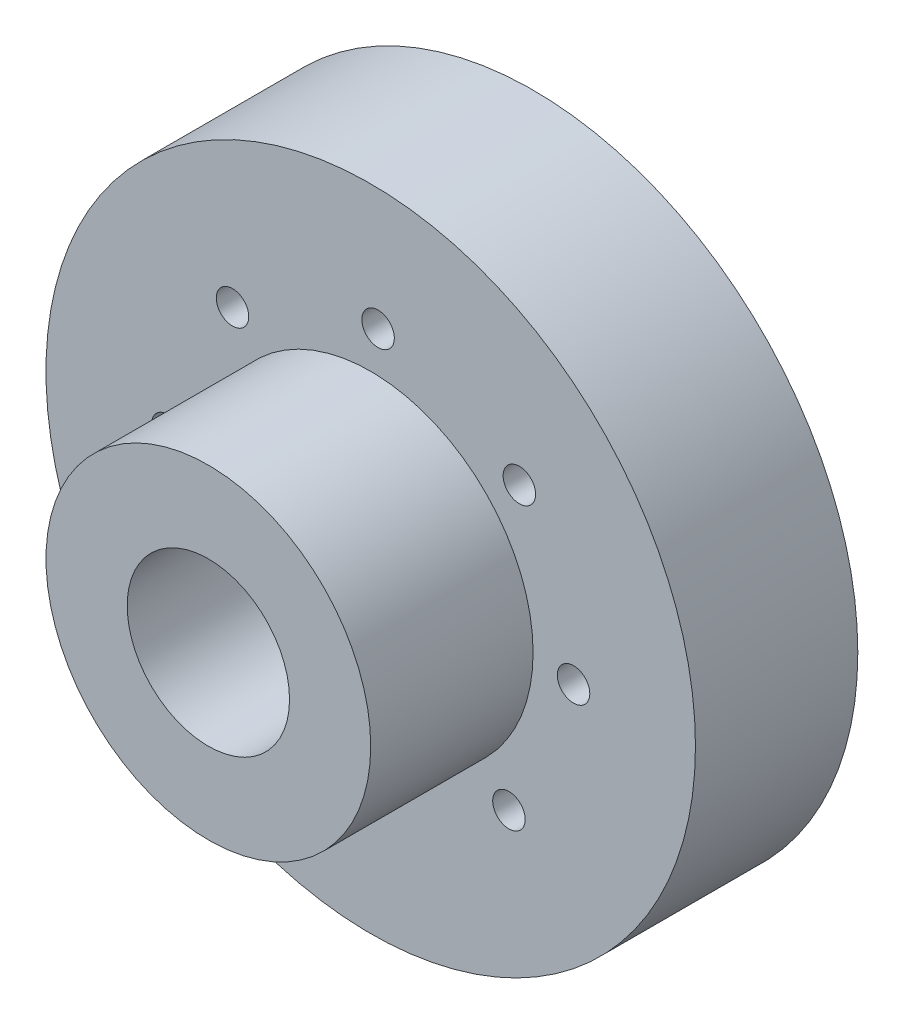
ISO-10303-21;
HEADER;
FILE_DESCRIPTION(('STEP AP214'),'2;1');
FILE_NAME('part.step','',(''),(''),'','','');
FILE_SCHEMA(('AUTOMOTIVE_DESIGN { 1 0 10303 214 1 1 1 1 }'));
ENDSEC;
DATA;
#1=APPLICATION_CONTEXT('core data for automotive mechanical design processes');
#2=APPLICATION_PROTOCOL_DEFINITION('international standard','automotive_design',2000,#1);
#3=PRODUCT_CONTEXT('',#1,'mechanical');
#4=PRODUCT('Part','Part','',(#3));
#5=PRODUCT_RELATED_PRODUCT_CATEGORY('part','',(#4));
#6=PRODUCT_DEFINITION_FORMATION('','',#4);
#7=PRODUCT_DEFINITION_CONTEXT('part definition',#1,'design');
#8=PRODUCT_DEFINITION('design','',#6,#7);
#9=PRODUCT_DEFINITION_SHAPE('','',#8);
#10=(LENGTH_UNIT() NAMED_UNIT(*) SI_UNIT(.MILLI.,.METRE.));
#11=(NAMED_UNIT(*) PLANE_ANGLE_UNIT() SI_UNIT($,.RADIAN.));
#12=(NAMED_UNIT(*) SI_UNIT($,.STERADIAN.) SOLID_ANGLE_UNIT());
#13=UNCERTAINTY_MEASURE_WITH_UNIT(LENGTH_MEASURE(1.E-05),#10,'distance_accuracy_value','');
#14=(GEOMETRIC_REPRESENTATION_CONTEXT(3) GLOBAL_UNCERTAINTY_ASSIGNED_CONTEXT((#13)) GLOBAL_UNIT_ASSIGNED_CONTEXT((#10,
#11,#12)) REPRESENTATION_CONTEXT('',''));
#15=CARTESIAN_POINT('',(0.,0.,0.));
#16=DIRECTION('',(0.,0.,1.));
#17=DIRECTION('',(1.,0.,0.));
#18=AXIS2_PLACEMENT_3D('',#15,#16,#17);
#19=CARTESIAN_POINT('',(0.,0.,12.7));
#20=DIRECTION('',(0.,0.,-1.));
#21=DIRECTION('',(-1.,0.,0.));
#22=AXIS2_PLACEMENT_3D('',#19,#20,#21);
#23=CYLINDRICAL_SURFACE('',#22,12.7);
#24=CARTESIAN_POINT('',(0.,0.,0.));
#25=DIRECTION('',(0.,0.,1.));
#26=DIRECTION('',(1.,0.,0.));
#27=AXIS2_PLACEMENT_3D('',#24,#25,#26);
#28=CIRCLE('',#27,12.7);
#29=CARTESIAN_POINT('',(12.7,0.,0.));
#30=VERTEX_POINT('',#29);
#31=EDGE_CURVE('E10',#30,#30,#28,.T.);
#32=ORIENTED_EDGE('',*,*,#31,.T.);
#33=EDGE_LOOP('',(#32));
#34=FACE_BOUND('',#33,.T.);
#35=CARTESIAN_POINT('',(0.,0.,6.35));
#36=DIRECTION('',(0.,0.,1.));
#37=DIRECTION('',(1.,0.,0.));
#38=AXIS2_PLACEMENT_3D('',#35,#36,#37);
#39=CIRCLE('',#38,12.7);
#40=CARTESIAN_POINT('',(12.7,0.,6.35));
#41=VERTEX_POINT('',#40);
#42=EDGE_CURVE('E32',#41,#41,#39,.T.);
#43=ORIENTED_EDGE('',*,*,#42,.F.);
#44=EDGE_LOOP('',(#43));
#45=FACE_BOUND('',#44,.T.);
#46=ADVANCED_FACE('F29',(#34,#45),#23,.T.);
#47=CARTESIAN_POINT('',(0.,0.,12.7));
#48=DIRECTION('',(0.,0.,1.));
#49=DIRECTION('',(1.,0.,0.));
#50=AXIS2_PLACEMENT_3D('',#47,#48,#49);
#51=PLANE('',#50);
#52=CARTESIAN_POINT('',(0.,0.,12.7));
#53=DIRECTION('',(0.,0.,1.));
#54=DIRECTION('',(1.,0.,0.));
#55=AXIS2_PLACEMENT_3D('',#52,#53,#54);
#56=CIRCLE('',#55,3.175);
#57=CARTESIAN_POINT('',(3.175,0.,12.7));
#58=VERTEX_POINT('',#57);
#59=EDGE_CURVE('E40',#58,#58,#56,.T.);
#60=ORIENTED_EDGE('',*,*,#59,.F.);
#61=EDGE_LOOP('',(#60));
#62=FACE_BOUND('',#61,.T.);
#63=CARTESIAN_POINT('',(0.,0.,12.7));
#64=DIRECTION('',(0.,0.,1.));
#65=DIRECTION('',(1.,0.,0.));
#66=AXIS2_PLACEMENT_3D('',#63,#64,#65);
#67=CIRCLE('',#66,6.35);
#68=CARTESIAN_POINT('',(6.35,0.,12.7));
#69=VERTEX_POINT('',#68);
#70=EDGE_CURVE('E45',#69,#69,#67,.T.);
#71=ORIENTED_EDGE('',*,*,#70,.T.);
#72=EDGE_LOOP('',(#71));
#73=FACE_BOUND('',#72,.T.);
#74=ADVANCED_FACE('F136',(#62,#73),#51,.T.);
#75=CARTESIAN_POINT('',(0.,0.,0.));
#76=DIRECTION('',(0.,0.,1.));
#77=DIRECTION('',(1.,0.,0.));
#78=AXIS2_PLACEMENT_3D('',#75,#76,#77);
#79=PLANE('',#78);
#80=CARTESIAN_POINT('',(-5.40521650843742,5.81270511439515,0.));
#81=DIRECTION('',(0.,0.,1.));
#82=DIRECTION('',(1.,0.,0.));
#83=AXIS2_PLACEMENT_3D('',#80,#81,#82);
#84=CIRCLE('',#83,0.635);
#85=CARTESIAN_POINT('',(-4.77021650843742,5.81270511439515,0.));
#86=VERTEX_POINT('',#85);
#87=EDGE_CURVE('E91',#86,#86,#84,.T.);
#88=ORIENTED_EDGE('',*,*,#87,.T.);
#89=EDGE_LOOP('',(#88));
#90=FACE_BOUND('',#89,.T.);
#91=CARTESIAN_POINT('',(-7.93226845032411,0.28813795652895,0.));
#92=DIRECTION('',(0.,0.,1.));
#93=DIRECTION('',(1.,0.,0.));
#94=AXIS2_PLACEMENT_3D('',#91,#92,#93);
#95=CIRCLE('',#94,0.635);
#96=CARTESIAN_POINT('',(-7.29726845032411,0.28813795652895,0.));
#97=VERTEX_POINT('',#96);
#98=EDGE_CURVE('E85',#97,#97,#95,.T.);
#99=ORIENTED_EDGE('',*,*,#98,.T.);
#100=EDGE_LOOP('',(#99));
#101=FACE_BOUND('',#100,.T.);
#102=CARTESIAN_POINT('',(-5.81270511439513,-5.40521650843744,0.));
#103=DIRECTION('',(0.,0.,1.));
#104=DIRECTION('',(1.,0.,0.));
#105=AXIS2_PLACEMENT_3D('',#102,#103,#104);
#106=CIRCLE('',#105,0.635000000000001);
#107=CARTESIAN_POINT('',(-5.17770511439513,-5.40521650843744,0.));
#108=VERTEX_POINT('',#107);
#109=EDGE_CURVE('E79',#108,#108,#106,.T.);
#110=ORIENTED_EDGE('',*,*,#109,.T.);
#111=EDGE_LOOP('',(#110));
#112=FACE_BOUND('',#111,.T.);
#113=CARTESIAN_POINT('',(-0.288137956528922,-7.93226845032411,0.));
#114=DIRECTION('',(0.,0.,1.));
#115=DIRECTION('',(1.,0.,0.));
#116=AXIS2_PLACEMENT_3D('',#113,#114,#115);
#117=CIRCLE('',#116,0.635);
#118=CARTESIAN_POINT('',(0.346862043471077,-7.93226845032411,0.));
#119=VERTEX_POINT('',#118);
#120=EDGE_CURVE('E73',#119,#119,#117,.T.);
#121=ORIENTED_EDGE('',*,*,#120,.T.);
#122=EDGE_LOOP('',(#121));
#123=FACE_BOUND('',#122,.T.);
#124=CARTESIAN_POINT('',(5.40521650843746,-5.81270511439511,0.));
#125=DIRECTION('',(0.,0.,1.));
#126=DIRECTION('',(1.,0.,0.));
#127=AXIS2_PLACEMENT_3D('',#124,#125,#126);
#128=CIRCLE('',#127,0.635);
#129=CARTESIAN_POINT('',(6.04021650843746,-5.81270511439511,0.));
#130=VERTEX_POINT('',#129);
#131=EDGE_CURVE('E67',#130,#130,#128,.T.);
#132=ORIENTED_EDGE('',*,*,#131,.T.);
#133=EDGE_LOOP('',(#132));
#134=FACE_BOUND('',#133,.T.);
#135=CARTESIAN_POINT('',(7.93226845032412,-0.288137956528896,0.));
#136=DIRECTION('',(0.,0.,1.));
#137=DIRECTION('',(1.,0.,0.));
#138=AXIS2_PLACEMENT_3D('',#135,#136,#137);
#139=CIRCLE('',#138,0.635);
#140=CARTESIAN_POINT('',(8.56726845032412,-0.288137956528896,0.));
#141=VERTEX_POINT('',#140);
#142=EDGE_CURVE('E61',#141,#141,#139,.T.);
#143=ORIENTED_EDGE('',*,*,#142,.T.);
#144=EDGE_LOOP('',(#143));
#145=FACE_BOUND('',#144,.T.);
#146=CARTESIAN_POINT('',(5.8127051143951,5.40521650843748,0.));
#147=DIRECTION('',(0.,0.,1.));
#148=DIRECTION('',(1.,0.,0.));
#149=AXIS2_PLACEMENT_3D('',#146,#147,#148);
#150=CIRCLE('',#149,0.635);
#151=CARTESIAN_POINT('',(6.4477051143951,5.40521650843748,0.));
#152=VERTEX_POINT('',#151);
#153=EDGE_CURVE('E55',#152,#152,#150,.T.);
#154=ORIENTED_EDGE('',*,*,#153,.T.);
#155=EDGE_LOOP('',(#154));
#156=FACE_BOUND('',#155,.T.);
#157=CARTESIAN_POINT('',(0.288137956528867,7.93226845032412,0.));
#158=DIRECTION('',(0.,0.,1.));
#159=DIRECTION('',(1.,0.,0.));
#160=AXIS2_PLACEMENT_3D('',#157,#158,#159);
#161=CIRCLE('',#160,0.635);
#162=CARTESIAN_POINT('',(0.923137956528867,7.93226845032412,0.));
#163=VERTEX_POINT('',#162);
#164=EDGE_CURVE('E49',#163,#163,#161,.T.);
#165=ORIENTED_EDGE('',*,*,#164,.T.);
#166=EDGE_LOOP('',(#165));
#167=FACE_BOUND('',#166,.T.);
#168=CARTESIAN_POINT('',(0.,0.,0.));
#169=DIRECTION('',(0.,0.,1.));
#170=DIRECTION('',(1.,0.,0.));
#171=AXIS2_PLACEMENT_3D('',#168,#169,#170);
#172=CIRCLE('',#171,3.175);
#173=CARTESIAN_POINT('',(3.175,0.,0.));
#174=VERTEX_POINT('',#173);
#175=EDGE_CURVE('E36',#174,#174,#172,.T.);
#176=ORIENTED_EDGE('',*,*,#175,.T.);
#177=EDGE_LOOP('',(#176));
#178=FACE_BOUND('',#177,.T.);
#179=ORIENTED_EDGE('',*,*,#31,.F.);
#180=EDGE_LOOP('',(#179));
#181=FACE_BOUND('',#180,.T.);
#182=ADVANCED_FACE('F100',(#90,#101,#112,#123,#134,#145,#156,#167,#178,#181),#79,.F.);
#183=CARTESIAN_POINT('',(0.,0.,0.));
#184=DIRECTION('',(0.,0.,1.));
#185=DIRECTION('',(1.,0.,0.));
#186=AXIS2_PLACEMENT_3D('',#183,#184,#185);
#187=CYLINDRICAL_SURFACE('',#186,3.175);
#188=ORIENTED_EDGE('',*,*,#175,.F.);
#189=EDGE_LOOP('',(#188));
#190=FACE_BOUND('',#189,.T.);
#191=ORIENTED_EDGE('',*,*,#59,.T.);
#192=EDGE_LOOP('',(#191));
#193=FACE_BOUND('',#192,.T.);
#194=ADVANCED_FACE('F114',(#190,#193),#187,.F.);
#195=CARTESIAN_POINT('',(0.,0.,6.35));
#196=DIRECTION('',(0.,0.,1.));
#197=DIRECTION('',(1.,0.,0.));
#198=AXIS2_PLACEMENT_3D('',#195,#196,#197);
#199=PLANE('',#198);
#200=CARTESIAN_POINT('',(-5.40521650843742,5.81270511439515,6.35));
#201=DIRECTION('',(0.,0.,1.));
#202=DIRECTION('',(1.,0.,0.));
#203=AXIS2_PLACEMENT_3D('',#200,#201,#202);
#204=CIRCLE('',#203,0.635);
#205=CARTESIAN_POINT('',(-4.77021650843742,5.81270511439515,6.35));
#206=VERTEX_POINT('',#205);
#207=EDGE_CURVE('E94',#206,#206,#204,.T.);
#208=ORIENTED_EDGE('',*,*,#207,.F.);
#209=EDGE_LOOP('',(#208));
#210=FACE_BOUND('',#209,.T.);
#211=CARTESIAN_POINT('',(-7.93226845032411,0.28813795652895,6.35));
#212=DIRECTION('',(0.,0.,1.));
#213=DIRECTION('',(1.,0.,0.));
#214=AXIS2_PLACEMENT_3D('',#211,#212,#213);
#215=CIRCLE('',#214,0.635);
#216=CARTESIAN_POINT('',(-7.29726845032411,0.28813795652895,6.35));
#217=VERTEX_POINT('',#216);
#218=EDGE_CURVE('E88',#217,#217,#215,.T.);
#219=ORIENTED_EDGE('',*,*,#218,.F.);
#220=EDGE_LOOP('',(#219));
#221=FACE_BOUND('',#220,.T.);
#222=CARTESIAN_POINT('',(-5.81270511439513,-5.40521650843744,6.35));
#223=DIRECTION('',(0.,0.,1.));
#224=DIRECTION('',(1.,0.,0.));
#225=AXIS2_PLACEMENT_3D('',#222,#223,#224);
#226=CIRCLE('',#225,0.635000000000001);
#227=CARTESIAN_POINT('',(-5.17770511439513,-5.40521650843744,6.35));
#228=VERTEX_POINT('',#227);
#229=EDGE_CURVE('E82',#228,#228,#226,.T.);
#230=ORIENTED_EDGE('',*,*,#229,.F.);
#231=EDGE_LOOP('',(#230));
#232=FACE_BOUND('',#231,.T.);
#233=CARTESIAN_POINT('',(-0.288137956528922,-7.93226845032411,6.35));
#234=DIRECTION('',(0.,0.,1.));
#235=DIRECTION('',(1.,0.,0.));
#236=AXIS2_PLACEMENT_3D('',#233,#234,#235);
#237=CIRCLE('',#236,0.635);
#238=CARTESIAN_POINT('',(0.346862043471077,-7.93226845032411,6.35));
#239=VERTEX_POINT('',#238);
#240=EDGE_CURVE('E76',#239,#239,#237,.T.);
#241=ORIENTED_EDGE('',*,*,#240,.F.);
#242=EDGE_LOOP('',(#241));
#243=FACE_BOUND('',#242,.T.);
#244=CARTESIAN_POINT('',(5.40521650843746,-5.81270511439511,6.35));
#245=DIRECTION('',(0.,0.,1.));
#246=DIRECTION('',(1.,0.,0.));
#247=AXIS2_PLACEMENT_3D('',#244,#245,#246);
#248=CIRCLE('',#247,0.635);
#249=CARTESIAN_POINT('',(6.04021650843746,-5.81270511439511,6.35));
#250=VERTEX_POINT('',#249);
#251=EDGE_CURVE('E70',#250,#250,#248,.T.);
#252=ORIENTED_EDGE('',*,*,#251,.F.);
#253=EDGE_LOOP('',(#252));
#254=FACE_BOUND('',#253,.T.);
#255=CARTESIAN_POINT('',(7.93226845032412,-0.288137956528896,6.35));
#256=DIRECTION('',(0.,0.,1.));
#257=DIRECTION('',(1.,0.,0.));
#258=AXIS2_PLACEMENT_3D('',#255,#256,#257);
#259=CIRCLE('',#258,0.635);
#260=CARTESIAN_POINT('',(8.56726845032412,-0.288137956528896,6.35));
#261=VERTEX_POINT('',#260);
#262=EDGE_CURVE('E64',#261,#261,#259,.T.);
#263=ORIENTED_EDGE('',*,*,#262,.F.);
#264=EDGE_LOOP('',(#263));
#265=FACE_BOUND('',#264,.T.);
#266=CARTESIAN_POINT('',(5.8127051143951,5.40521650843748,6.35));
#267=DIRECTION('',(0.,0.,1.));
#268=DIRECTION('',(1.,0.,0.));
#269=AXIS2_PLACEMENT_3D('',#266,#267,#268);
#270=CIRCLE('',#269,0.635);
#271=CARTESIAN_POINT('',(6.4477051143951,5.40521650843748,6.35));
#272=VERTEX_POINT('',#271);
#273=EDGE_CURVE('E58',#272,#272,#270,.T.);
#274=ORIENTED_EDGE('',*,*,#273,.F.);
#275=EDGE_LOOP('',(#274));
#276=FACE_BOUND('',#275,.T.);
#277=CARTESIAN_POINT('',(0.288137956528867,7.93226845032412,6.35));
#278=DIRECTION('',(0.,0.,1.));
#279=DIRECTION('',(1.,0.,0.));
#280=AXIS2_PLACEMENT_3D('',#277,#278,#279);
#281=CIRCLE('',#280,0.635);
#282=CARTESIAN_POINT('',(0.923137956528867,7.93226845032412,6.35));
#283=VERTEX_POINT('',#282);
#284=EDGE_CURVE('E52',#283,#283,#281,.T.);
#285=ORIENTED_EDGE('',*,*,#284,.F.);
#286=EDGE_LOOP('',(#285));
#287=FACE_BOUND('',#286,.T.);
#288=CARTESIAN_POINT('',(0.,0.,6.35));
#289=DIRECTION('',(0.,0.,1.));
#290=DIRECTION('',(1.,0.,0.));
#291=AXIS2_PLACEMENT_3D('',#288,#289,#290);
#292=CIRCLE('',#291,6.35);
#293=CARTESIAN_POINT('',(6.35,0.,6.35));
#294=VERTEX_POINT('',#293);
#295=EDGE_CURVE('E48',#294,#294,#292,.T.);
#296=ORIENTED_EDGE('',*,*,#295,.F.);
#297=EDGE_LOOP('',(#296));
#298=FACE_BOUND('',#297,.T.);
#299=ORIENTED_EDGE('',*,*,#42,.T.);
#300=EDGE_LOOP('',(#299));
#301=FACE_BOUND('',#300,.T.);
#302=ADVANCED_FACE('F110',(#210,#221,#232,#243,#254,#265,#276,#287,#298,#301),#199,.T.);
#303=CARTESIAN_POINT('',(0.,0.,6.35));
#304=DIRECTION('',(0.,0.,1.));
#305=DIRECTION('',(1.,0.,0.));
#306=AXIS2_PLACEMENT_3D('',#303,#304,#305);
#307=CYLINDRICAL_SURFACE('',#306,6.35);
#308=ORIENTED_EDGE('',*,*,#295,.T.);
#309=EDGE_LOOP('',(#308));
#310=FACE_BOUND('',#309,.T.);
#311=ORIENTED_EDGE('',*,*,#70,.F.);
#312=EDGE_LOOP('',(#311));
#313=FACE_BOUND('',#312,.T.);
#314=ADVANCED_FACE('F113',(#310,#313),#307,.T.);
#315=CARTESIAN_POINT('',(0.288137956528867,7.93226845032412,0.));
#316=DIRECTION('',(0.,0.,1.));
#317=DIRECTION('',(1.,0.,0.));
#318=AXIS2_PLACEMENT_3D('',#315,#316,#317);
#319=CYLINDRICAL_SURFACE('',#318,0.635);
#320=ORIENTED_EDGE('',*,*,#164,.F.);
#321=EDGE_LOOP('',(#320));
#322=FACE_BOUND('',#321,.T.);
#323=ORIENTED_EDGE('',*,*,#284,.T.);
#324=EDGE_LOOP('',(#323));
#325=FACE_BOUND('',#324,.T.);
#326=ADVANCED_FACE('F153',(#322,#325),#319,.F.);
#327=CARTESIAN_POINT('',(5.8127051143951,5.40521650843748,0.));
#328=DIRECTION('',(0.,0.,1.));
#329=DIRECTION('',(1.,0.,0.));
#330=AXIS2_PLACEMENT_3D('',#327,#328,#329);
#331=CYLINDRICAL_SURFACE('',#330,0.635);
#332=ORIENTED_EDGE('',*,*,#153,.F.);
#333=EDGE_LOOP('',(#332));
#334=FACE_BOUND('',#333,.T.);
#335=ORIENTED_EDGE('',*,*,#273,.T.);
#336=EDGE_LOOP('',(#335));
#337=FACE_BOUND('',#336,.T.);
#338=ADVANCED_FACE('F157',(#334,#337),#331,.F.);
#339=CARTESIAN_POINT('',(7.93226845032412,-0.288137956528896,0.));
#340=DIRECTION('',(0.,0.,1.));
#341=DIRECTION('',(1.,0.,0.));
#342=AXIS2_PLACEMENT_3D('',#339,#340,#341);
#343=CYLINDRICAL_SURFACE('',#342,0.635);
#344=ORIENTED_EDGE('',*,*,#142,.F.);
#345=EDGE_LOOP('',(#344));
#346=FACE_BOUND('',#345,.T.);
#347=ORIENTED_EDGE('',*,*,#262,.T.);
#348=EDGE_LOOP('',(#347));
#349=FACE_BOUND('',#348,.T.);
#350=ADVANCED_FACE('F161',(#346,#349),#343,.F.);
#351=CARTESIAN_POINT('',(5.40521650843746,-5.81270511439511,0.));
#352=DIRECTION('',(0.,0.,1.));
#353=DIRECTION('',(1.,0.,0.));
#354=AXIS2_PLACEMENT_3D('',#351,#352,#353);
#355=CYLINDRICAL_SURFACE('',#354,0.635);
#356=ORIENTED_EDGE('',*,*,#131,.F.);
#357=EDGE_LOOP('',(#356));
#358=FACE_BOUND('',#357,.T.);
#359=ORIENTED_EDGE('',*,*,#251,.T.);
#360=EDGE_LOOP('',(#359));
#361=FACE_BOUND('',#360,.T.);
#362=ADVANCED_FACE('F165',(#358,#361),#355,.F.);
#363=CARTESIAN_POINT('',(-0.288137956528922,-7.93226845032411,0.));
#364=DIRECTION('',(0.,0.,1.));
#365=DIRECTION('',(1.,0.,0.));
#366=AXIS2_PLACEMENT_3D('',#363,#364,#365);
#367=CYLINDRICAL_SURFACE('',#366,0.635);
#368=ORIENTED_EDGE('',*,*,#120,.F.);
#369=EDGE_LOOP('',(#368));
#370=FACE_BOUND('',#369,.T.);
#371=ORIENTED_EDGE('',*,*,#240,.T.);
#372=EDGE_LOOP('',(#371));
#373=FACE_BOUND('',#372,.T.);
#374=ADVANCED_FACE('F169',(#370,#373),#367,.F.);
#375=CARTESIAN_POINT('',(-5.81270511439513,-5.40521650843744,0.));
#376=DIRECTION('',(0.,0.,1.));
#377=DIRECTION('',(1.,0.,0.));
#378=AXIS2_PLACEMENT_3D('',#375,#376,#377);
#379=CYLINDRICAL_SURFACE('',#378,0.635000000000001);
#380=ORIENTED_EDGE('',*,*,#109,.F.);
#381=EDGE_LOOP('',(#380));
#382=FACE_BOUND('',#381,.T.);
#383=ORIENTED_EDGE('',*,*,#229,.T.);
#384=EDGE_LOOP('',(#383));
#385=FACE_BOUND('',#384,.T.);
#386=ADVANCED_FACE('F173',(#382,#385),#379,.F.);
#387=CARTESIAN_POINT('',(-7.93226845032411,0.28813795652895,0.));
#388=DIRECTION('',(0.,0.,1.));
#389=DIRECTION('',(1.,0.,0.));
#390=AXIS2_PLACEMENT_3D('',#387,#388,#389);
#391=CYLINDRICAL_SURFACE('',#390,0.635);
#392=ORIENTED_EDGE('',*,*,#98,.F.);
#393=EDGE_LOOP('',(#392));
#394=FACE_BOUND('',#393,.T.);
#395=ORIENTED_EDGE('',*,*,#218,.T.);
#396=EDGE_LOOP('',(#395));
#397=FACE_BOUND('',#396,.T.);
#398=ADVANCED_FACE('F106',(#394,#397),#391,.F.);
#399=CARTESIAN_POINT('',(-5.40521650843742,5.81270511439515,0.));
#400=DIRECTION('',(0.,0.,1.));
#401=DIRECTION('',(1.,0.,0.));
#402=AXIS2_PLACEMENT_3D('',#399,#400,#401);
#403=CYLINDRICAL_SURFACE('',#402,0.635);
#404=ORIENTED_EDGE('',*,*,#87,.F.);
#405=EDGE_LOOP('',(#404));
#406=FACE_BOUND('',#405,.T.);
#407=ORIENTED_EDGE('',*,*,#207,.T.);
#408=EDGE_LOOP('',(#407));
#409=FACE_BOUND('',#408,.T.);
#410=ADVANCED_FACE('F103',(#406,#409),#403,.F.);
#411=CLOSED_SHELL('',(#46,#74,#182,#194,#302,#314,#326,#338,#350,#362,#374,#386,#398,#410));
#412=MANIFOLD_SOLID_BREP('B2',#411);
#413=ADVANCED_BREP_SHAPE_REPRESENTATION('',(#18,#412),#14);
#414=SHAPE_DEFINITION_REPRESENTATION(#9,#413);
ENDSEC;
END-ISO-10303-21;
